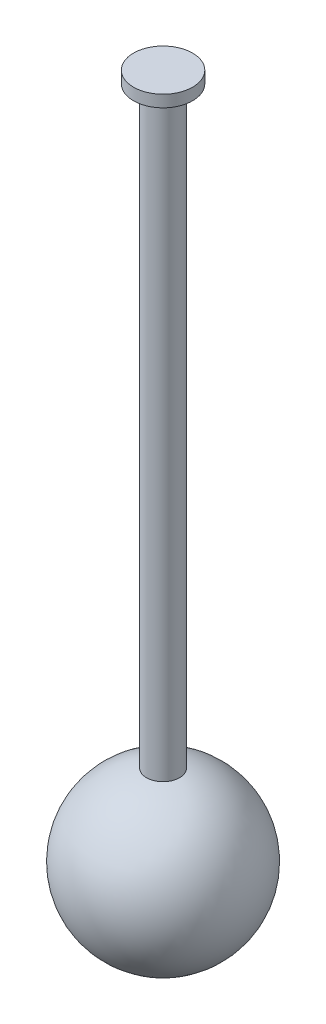
ISO-10303-21;
HEADER;
FILE_DESCRIPTION(('STEP AP214'),'2;1');
FILE_NAME('part.step','',(''),(''),'','','');
FILE_SCHEMA(('AUTOMOTIVE_DESIGN { 1 0 10303 214 1 1 1 1 }'));
ENDSEC;
DATA;
#1=APPLICATION_CONTEXT('core data for automotive mechanical design processes');
#2=APPLICATION_PROTOCOL_DEFINITION('international standard','automotive_design',2000,#1);
#3=PRODUCT_CONTEXT('',#1,'mechanical');
#4=PRODUCT('Part','Part','',(#3));
#5=PRODUCT_RELATED_PRODUCT_CATEGORY('part','',(#4));
#6=PRODUCT_DEFINITION_FORMATION('','',#4);
#7=PRODUCT_DEFINITION_CONTEXT('part definition',#1,'design');
#8=PRODUCT_DEFINITION('design','',#6,#7);
#9=PRODUCT_DEFINITION_SHAPE('','',#8);
#10=(LENGTH_UNIT() NAMED_UNIT(*) SI_UNIT(.MILLI.,.METRE.));
#11=(NAMED_UNIT(*) PLANE_ANGLE_UNIT() SI_UNIT($,.RADIAN.));
#12=(NAMED_UNIT(*) SI_UNIT($,.STERADIAN.) SOLID_ANGLE_UNIT());
#13=UNCERTAINTY_MEASURE_WITH_UNIT(LENGTH_MEASURE(1.E-05),#10,'distance_accuracy_value','');
#14=(GEOMETRIC_REPRESENTATION_CONTEXT(3) GLOBAL_UNCERTAINTY_ASSIGNED_CONTEXT((#13)) GLOBAL_UNIT_ASSIGNED_CONTEXT((#10,
#11,#12)) REPRESENTATION_CONTEXT('',''));
#15=CARTESIAN_POINT('',(0.,0.,0.));
#16=DIRECTION('',(0.,0.,1.));
#17=DIRECTION('',(1.,0.,0.));
#18=AXIS2_PLACEMENT_3D('',#15,#16,#17);
#19=CARTESIAN_POINT('',(0.,0.,0.));
#20=DIRECTION('',(0.,1.,0.));
#21=DIRECTION('',(-1.,0.,0.));
#22=AXIS2_PLACEMENT_3D('',#19,#20,#21);
#23=SPHERICAL_SURFACE('',#22,3.488);
#24=CARTESIAN_POINT('',(0.,3.41703731322911,0.));
#25=DIRECTION('',(0.,-1.,0.));
#26=DIRECTION('',(0.,0.,-1.));
#27=AXIS2_PLACEMENT_3D('',#24,#25,#26);
#28=CIRCLE('',#27,0.7);
#29=CARTESIAN_POINT('',(0.,3.41703731322911,-0.7));
#30=VERTEX_POINT('',#29);
#31=EDGE_CURVE('E10',#30,#30,#28,.F.);
#32=ORIENTED_EDGE('',*,*,#31,.F.);
#33=EDGE_LOOP('',(#32));
#34=FACE_BOUND('',#33,.T.);
#35=ADVANCED_FACE('F36',(#34),#23,.T.);
#36=CARTESIAN_POINT('',(0.,28.5,0.));
#37=DIRECTION('',(0.,-1.,0.));
#38=DIRECTION('',(0.,0.,-1.));
#39=AXIS2_PLACEMENT_3D('',#36,#37,#38);
#40=CYLINDRICAL_SURFACE('',#39,0.7);
#41=CARTESIAN_POINT('',(0.,28.5,0.));
#42=DIRECTION('',(0.,1.,0.));
#43=DIRECTION('',(0.,0.,1.));
#44=AXIS2_PLACEMENT_3D('',#41,#42,#43);
#45=CIRCLE('',#44,0.7);
#46=CARTESIAN_POINT('',(0.,28.5,-0.7));
#47=VERTEX_POINT('',#46);
#48=EDGE_CURVE('E47',#47,#47,#45,.T.);
#49=CARTESIAN_POINT('',(0.,28.5,-0.7));
#50=CARTESIAN_POINT('',(0.,28.2387191386795,-0.7));
#51=CARTESIAN_POINT('',(0.,27.9774382773589,-0.7));
#52=CARTESIAN_POINT('',(0.,27.4548765547179,-0.7));
#53=CARTESIAN_POINT('',(0.,27.1935956933974,-0.7));
#54=CARTESIAN_POINT('',(0.,26.6710339707563,-0.7));
#55=CARTESIAN_POINT('',(0.,26.4097531094358,-0.7));
#56=CARTESIAN_POINT('',(0.,25.8871913867947,-0.7));
#57=CARTESIAN_POINT('',(0.,25.6259105254742,-0.7));
#58=CARTESIAN_POINT('',(0.,25.1033488028331,-0.7));
#59=CARTESIAN_POINT('',(0.,24.8420679415126,-0.7));
#60=CARTESIAN_POINT('',(0.,24.3195062188715,-0.7));
#61=CARTESIAN_POINT('',(0.,24.058225357551,-0.7));
#62=CARTESIAN_POINT('',(0.,23.5356636349099,-0.7));
#63=CARTESIAN_POINT('',(0.,23.2743827735894,-0.7));
#64=CARTESIAN_POINT('',(0.,22.7518210509483,-0.7));
#65=CARTESIAN_POINT('',(0.,22.4905401896278,-0.7));
#66=CARTESIAN_POINT('',(0.,21.9679784669867,-0.7));
#67=CARTESIAN_POINT('',(0.,21.7066976056662,-0.7));
#68=CARTESIAN_POINT('',(0.,21.1841358830252,-0.7));
#69=CARTESIAN_POINT('',(0.,20.9228550217046,-0.7));
#70=CARTESIAN_POINT('',(0.,20.4002932990636,-0.7));
#71=CARTESIAN_POINT('',(0.,20.139012437743,-0.7));
#72=CARTESIAN_POINT('',(0.,19.616450715102,-0.7));
#73=CARTESIAN_POINT('',(0.,19.3551698537815,-0.7));
#74=CARTESIAN_POINT('',(0.,18.8326081311404,-0.7));
#75=CARTESIAN_POINT('',(0.,18.5713272698199,-0.7));
#76=CARTESIAN_POINT('',(0.,18.0487655471788,-0.7));
#77=CARTESIAN_POINT('',(0.,17.7874846858583,-0.7));
#78=CARTESIAN_POINT('',(0.,17.2649229632172,-0.7));
#79=CARTESIAN_POINT('',(0.,17.0036421018967,-0.7));
#80=CARTESIAN_POINT('',(0.,16.4810803792556,-0.7));
#81=CARTESIAN_POINT('',(0.,16.2197995179351,-0.7));
#82=CARTESIAN_POINT('',(0.,15.697237795294,-0.7));
#83=CARTESIAN_POINT('',(0.,15.4359569339735,-0.7));
#84=CARTESIAN_POINT('',(0.,14.9133952113324,-0.7));
#85=CARTESIAN_POINT('',(0.,14.6521143500119,-0.7));
#86=CARTESIAN_POINT('',(0.,14.1295526273708,-0.7));
#87=CARTESIAN_POINT('',(0.,13.8682717660503,-0.7));
#88=CARTESIAN_POINT('',(0.,13.3457100434093,-0.7));
#89=CARTESIAN_POINT('',(0.,13.0844291820887,-0.7));
#90=CARTESIAN_POINT('',(0.,12.5618674594477,-0.7));
#91=CARTESIAN_POINT('',(0.,12.3005865981271,-0.7));
#92=CARTESIAN_POINT('',(0.,11.7780248754861,-0.7));
#93=CARTESIAN_POINT('',(0.,11.5167440141655,-0.7));
#94=CARTESIAN_POINT('',(0.,10.9941822915245,-0.7));
#95=CARTESIAN_POINT('',(0.,10.732901430204,-0.7));
#96=CARTESIAN_POINT('',(0.,10.2103397075629,-0.7));
#97=CARTESIAN_POINT('',(0.,9.94905884624237,-0.7));
#98=CARTESIAN_POINT('',(0.,9.42649712360131,-0.7));
#99=CARTESIAN_POINT('',(0.,9.16521626228078,-0.7));
#100=CARTESIAN_POINT('',(0.,8.64265453963972,-0.7));
#101=CARTESIAN_POINT('',(0.,8.38137367831919,-0.7));
#102=CARTESIAN_POINT('',(0.,7.85881195567813,-0.7));
#103=CARTESIAN_POINT('',(0.,7.59753109435759,-0.7));
#104=CARTESIAN_POINT('',(0.,7.07496937171653,-0.7));
#105=CARTESIAN_POINT('',(0.,6.813688510396,-0.7));
#106=CARTESIAN_POINT('',(0.,6.29112678775495,-0.7));
#107=CARTESIAN_POINT('',(0.,6.02984592643442,-0.7));
#108=CARTESIAN_POINT('',(0.,5.50728420379336,-0.7));
#109=CARTESIAN_POINT('',(0.,5.24600334247283,-0.7));
#110=CARTESIAN_POINT('',(0.,4.72344161983176,-0.7));
#111=CARTESIAN_POINT('',(0.,4.46216075851124,-0.7));
#112=CARTESIAN_POINT('',(0.,3.93959903587017,-0.7));
#113=CARTESIAN_POINT('',(0.,3.67831817454964,-0.7));
#114=CARTESIAN_POINT('',(0.,3.41703731322911,-0.7));
#115=B_SPLINE_CURVE_WITH_KNOTS('',3,(#49,#50,#51,#52,#53,#54,#55,#56,#57,#58,#59,#60,#61,#62,
#63,#64,#65,#66,#67,#68,#69,#70,#71,#72,#73,#74,#75,#76,#77,#78,#79,#80,#81,#82,#83,#84,#85,#86,
#87,#88,#89,#90,#91,#92,#93,#94,#95,#96,#97,#98,#99,#100,#101,#102,#103,#104,#105,#106,#107,
#108,#109,#110,#111,#112,#113,#114),.UNSPECIFIED.,.F.,.F.,(4,2,2,2,2,2,2,2,2,2,2,2,2,2,2,2,2,2,
2,2,2,2,2,2,2,2,2,2,2,2,2,2,4),(0.,0.783842583961587,1.56768516792318,2.35152775188477,
3.13537033584636,3.91921291980795,4.70305550376954,5.48689808773113,6.27074067169272,
7.05458325565431,7.8384258396159,8.62226842357749,9.40611100753908,10.1899535915007,
10.9737961754623,11.7576387594239,12.5414813433854,13.325323927347,14.1091665113086,
14.8930090952702,15.6768516792318,16.4606942631934,17.244536847155,18.0283794311166,
18.8122220150782,19.5960645990398,20.3799071830013,21.1637497669629,21.9475923509245,
22.7314349348861,23.5152775188477,24.2991201028093,25.0829626867709),.UNSPECIFIED.);
#116=EDGE_CURVE('BSEAM66',#47,#30,#115,.T.);
#117=ORIENTED_EDGE('',*,*,#48,.F.);
#118=ORIENTED_EDGE('',*,*,#31,.T.);
#119=ORIENTED_EDGE('',*,*,#116,.T.);
#120=ORIENTED_EDGE('',*,*,#116,.F.);
#121=EDGE_LOOP('',(#117,#119,#118,#120));
#122=FACE_BOUND('',#121,.T.);
#123=ADVANCED_FACE('F66',(#122),#40,.T.);
#124=CARTESIAN_POINT('',(0.,29.,0.));
#125=DIRECTION('',(0.,-1.,0.));
#126=DIRECTION('',(0.,0.,-1.));
#127=AXIS2_PLACEMENT_3D('',#124,#125,#126);
#128=CYLINDRICAL_SURFACE('',#127,1.25);
#129=CARTESIAN_POINT('',(0.,29.,0.));
#130=DIRECTION('',(0.,1.,0.));
#131=DIRECTION('',(0.,0.,1.));
#132=AXIS2_PLACEMENT_3D('',#129,#130,#131);
#133=CIRCLE('',#132,1.25);
#134=CARTESIAN_POINT('',(0.,29.,1.25));
#135=VERTEX_POINT('',#134);
#136=EDGE_CURVE('E52',#135,#135,#133,.T.);
#137=ORIENTED_EDGE('',*,*,#136,.F.);
#138=EDGE_LOOP('',(#137));
#139=FACE_BOUND('',#138,.T.);
#140=CARTESIAN_POINT('',(0.,28.5,0.));
#141=DIRECTION('',(0.,1.,0.));
#142=DIRECTION('',(0.,0.,1.));
#143=AXIS2_PLACEMENT_3D('',#140,#141,#142);
#144=CIRCLE('',#143,1.25);
#145=CARTESIAN_POINT('',(0.,28.5,1.25));
#146=VERTEX_POINT('',#145);
#147=EDGE_CURVE('E55',#146,#146,#144,.T.);
#148=ORIENTED_EDGE('',*,*,#147,.T.);
#149=EDGE_LOOP('',(#148));
#150=FACE_BOUND('',#149,.T.);
#151=ADVANCED_FACE('F63',(#139,#150),#128,.T.);
#152=CARTESIAN_POINT('',(0.,29.,0.));
#153=DIRECTION('',(0.,1.,0.));
#154=DIRECTION('',(0.,0.,1.));
#155=AXIS2_PLACEMENT_3D('',#152,#153,#154);
#156=PLANE('',#155);
#157=ORIENTED_EDGE('',*,*,#136,.T.);
#158=EDGE_LOOP('',(#157));
#159=FACE_BOUND('',#158,.T.);
#160=ADVANCED_FACE('F61',(#159),#156,.T.);
#161=CARTESIAN_POINT('',(0.,28.5,0.));
#162=DIRECTION('',(0.,1.,0.));
#163=DIRECTION('',(0.,0.,1.));
#164=AXIS2_PLACEMENT_3D('',#161,#162,#163);
#165=PLANE('',#164);
#166=ORIENTED_EDGE('',*,*,#48,.T.);
#167=EDGE_LOOP('',(#166));
#168=FACE_BOUND('',#167,.T.);
#169=ORIENTED_EDGE('',*,*,#147,.F.);
#170=EDGE_LOOP('',(#169));
#171=FACE_BOUND('',#170,.T.);
#172=ADVANCED_FACE('F70',(#168,#171),#165,.F.);
#173=CLOSED_SHELL('',(#35,#123,#151,#160,#172));
#174=CARTESIAN_POINT('',(0.,0.,0.));
#175=DIRECTION('',(0.,1.,0.));
#176=DIRECTION('',(-1.,0.,0.));
#177=AXIS2_PLACEMENT_3D('',#174,#175,#176);
#178=SPHERICAL_SURFACE('',#177,3.46);
#179=CARTESIAN_POINT('',(0.,3.38845097352759,0.));
#180=DIRECTION('',(0.,-1.,0.));
#181=DIRECTION('',(0.,0.,-1.));
#182=AXIS2_PLACEMENT_3D('',#179,#180,#181);
#183=CIRCLE('',#182,0.7);
#184=CARTESIAN_POINT('',(0.,3.38845097352759,-0.7));
#185=VERTEX_POINT('',#184);
#186=EDGE_CURVE('E39',#185,#185,#183,.F.);
#187=ORIENTED_EDGE('',*,*,#186,.T.);
#188=EDGE_LOOP('',(#187));
#189=FACE_BOUND('',#188,.T.);
#190=ADVANCED_FACE('F98',(#189),#178,.F.);
#191=CARTESIAN_POINT('',(0.,0.,0.));
#192=DIRECTION('',(0.,1.,0.));
#193=DIRECTION('',(0.,0.,1.));
#194=AXIS2_PLACEMENT_3D('',#191,#192,#193);
#195=PLANE('',#194);
#196=CARTESIAN_POINT('',(0.,0.,0.));
#197=DIRECTION('',(0.,1.,0.));
#198=DIRECTION('',(0.,0.,1.));
#199=AXIS2_PLACEMENT_3D('',#196,#197,#198);
#200=CIRCLE('',#199,0.7);
#201=CARTESIAN_POINT('',(0.,0.,-0.7));
#202=VERTEX_POINT('',#201);
#203=EDGE_CURVE('E49',#202,#202,#200,.T.);
#204=ORIENTED_EDGE('',*,*,#203,.F.);
#205=EDGE_LOOP('',(#204));
#206=FACE_BOUND('',#205,.T.);
#207=ADVANCED_FACE('F92',(#206),#195,.F.);
#208=CARTESIAN_POINT('',(0.,3.38845097352759,-0.7));
#209=CARTESIAN_POINT('',(0.,3.35315460922001,-0.7));
#210=CARTESIAN_POINT('',(0.,3.31785824491243,-0.7));
#211=CARTESIAN_POINT('',(0.,3.24726551629727,-0.7));
#212=CARTESIAN_POINT('',(0.,3.21196915198969,-0.7));
#213=CARTESIAN_POINT('',(0.,3.14137642337453,-0.7));
#214=CARTESIAN_POINT('',(0.,3.10608005906695,-0.7));
#215=CARTESIAN_POINT('',(0.,3.0354873304518,-0.7));
#216=CARTESIAN_POINT('',(0.,3.00019096614422,-0.7));
#217=CARTESIAN_POINT('',(0.,2.92959823752906,-0.7));
#218=CARTESIAN_POINT('',(0.,2.89430187322148,-0.7));
#219=CARTESIAN_POINT('',(0.,2.82370914460632,-0.7));
#220=CARTESIAN_POINT('',(0.,2.78841278029874,-0.7));
#221=CARTESIAN_POINT('',(0.,2.71782005168359,-0.7));
#222=CARTESIAN_POINT('',(0.,2.68252368737601,-0.7));
#223=CARTESIAN_POINT('',(0.,2.61193095876085,-0.7));
#224=CARTESIAN_POINT('',(0.,2.57663459445327,-0.7));
#225=CARTESIAN_POINT('',(0.,2.50604186583811,-0.7));
#226=CARTESIAN_POINT('',(0.,2.47074550153053,-0.7));
#227=CARTESIAN_POINT('',(0.,2.40015277291537,-0.7));
#228=CARTESIAN_POINT('',(0.,2.36485640860779,-0.7));
#229=CARTESIAN_POINT('',(0.,2.29426367999264,-0.7));
#230=CARTESIAN_POINT('',(0.,2.25896731568506,-0.7));
#231=CARTESIAN_POINT('',(0.,2.1883745870699,-0.7));
#232=CARTESIAN_POINT('',(0.,2.15307822276232,-0.7));
#233=CARTESIAN_POINT('',(0.,2.08248549414716,-0.7));
#234=CARTESIAN_POINT('',(0.,2.04718912983958,-0.7));
#235=CARTESIAN_POINT('',(0.,1.97659640122442,-0.7));
#236=CARTESIAN_POINT('',(0.,1.94130003691685,-0.7));
#237=CARTESIAN_POINT('',(0.,1.87070730830169,-0.7));
#238=CARTESIAN_POINT('',(0.,1.83541094399411,-0.7));
#239=CARTESIAN_POINT('',(0.,1.76481821537895,-0.7));
#240=CARTESIAN_POINT('',(0.,1.72952185107137,-0.7));
#241=CARTESIAN_POINT('',(0.,1.65892912245621,-0.7));
#242=CARTESIAN_POINT('',(0.,1.62363275814864,-0.7));
#243=CARTESIAN_POINT('',(0.,1.55304002953348,-0.7));
#244=CARTESIAN_POINT('',(0.,1.5177436652259,-0.7));
#245=CARTESIAN_POINT('',(0.,1.44715093661074,-0.7));
#246=CARTESIAN_POINT('',(0.,1.41185457230316,-0.7));
#247=CARTESIAN_POINT('',(0.,1.341261843688,-0.7));
#248=CARTESIAN_POINT('',(0.,1.30596547938042,-0.7));
#249=CARTESIAN_POINT('',(0.,1.23537275076527,-0.7));
#250=CARTESIAN_POINT('',(0.,1.20007638645769,-0.7));
#251=CARTESIAN_POINT('',(0.,1.12948365784253,-0.7));
#252=CARTESIAN_POINT('',(0.,1.09418729353495,-0.7));
#253=CARTESIAN_POINT('',(0.,1.02359456491979,-0.7));
#254=CARTESIAN_POINT('',(0.,0.988298200612212,-0.7));
#255=CARTESIAN_POINT('',(0.,0.917705471997053,-0.7));
#256=CARTESIAN_POINT('',(0.,0.882409107689474,-0.7));
#257=CARTESIAN_POINT('',(0.,0.811816379074316,-0.7));
#258=CARTESIAN_POINT('',(0.,0.776520014766737,-0.7));
#259=CARTESIAN_POINT('',(0.,0.705927286151579,-0.7));
#260=CARTESIAN_POINT('',(0.,0.670630921844,-0.7));
#261=CARTESIAN_POINT('',(0.,0.600038193228842,-0.7));
#262=CARTESIAN_POINT('',(0.,0.564741828921263,-0.7));
#263=CARTESIAN_POINT('',(0.,0.494149100306105,-0.7));
#264=CARTESIAN_POINT('',(0.,0.458852735998526,-0.7));
#265=CARTESIAN_POINT('',(0.,0.388260007383368,-0.7));
#266=CARTESIAN_POINT('',(0.,0.352963643075789,-0.7));
#267=CARTESIAN_POINT('',(0.,0.282370914460632,-0.7));
#268=CARTESIAN_POINT('',(0.,0.247074550153053,-0.7));
#269=CARTESIAN_POINT('',(0.,0.176481821537895,-0.7));
#270=CARTESIAN_POINT('',(0.,0.141185457230316,-0.7));
#271=CARTESIAN_POINT('',(0.,0.0705927286151579,-0.7));
#272=CARTESIAN_POINT('',(0.,0.035296364307579,-0.7));
#273=CARTESIAN_POINT('',(0.,0.,-0.7));
#274=B_SPLINE_CURVE_WITH_KNOTS('',3,(#208,#209,#210,#211,#212,#213,#214,#215,#216,#217,#218,
#219,#220,#221,#222,#223,#224,#225,#226,#227,#228,#229,#230,#231,#232,#233,#234,#235,#236,#237,
#238,#239,#240,#241,#242,#243,#244,#245,#246,#247,#248,#249,#250,#251,#252,#253,#254,#255,#256,
#257,#258,#259,#260,#261,#262,#263,#264,#265,#266,#267,#268,#269,#270,#271,#272,#273),
.UNSPECIFIED.,.F.,.F.,(4,2,2,2,2,2,2,2,2,2,2,2,2,2,2,2,2,2,2,2,2,2,2,2,2,2,2,2,2,2,2,2,4),(0.,
0.105889092922737,0.211778185845474,0.317667278768211,0.423556371690947,0.529445464613684,
0.635334557536421,0.741223650459158,0.847112743381895,0.953001836304635,1.05889092922737,
1.16478002215011,1.27066911507285,1.37655820799558,1.48244730091832,1.58833639384106,
1.69422548676379,1.80011457968653,1.90600367260927,2.011892765532,2.11778185845474,
2.22367095137748,2.32956004430021,2.43544913722295,2.54133823014569,2.64722732306843,
2.75311641599116,2.8590055089139,2.96489460183664,3.07078369475938,3.17667278768211,
3.28256188060485,3.38845097352759),.UNSPECIFIED.);
#275=EDGE_CURVE('BSEAM86',#185,#202,#274,.T.);
#276=ORIENTED_EDGE('',*,*,#186,.F.);
#277=ORIENTED_EDGE('',*,*,#203,.T.);
#278=ORIENTED_EDGE('',*,*,#275,.T.);
#279=ORIENTED_EDGE('',*,*,#275,.F.);
#280=EDGE_LOOP('',(#276,#278,#277,#279));
#281=FACE_BOUND('',#280,.T.);
#282=ADVANCED_FACE('F86',(#281),#40,.T.);
#283=CLOSED_SHELL('',(#190,#207,#282));
#284=ORIENTED_CLOSED_SHELL('',*,#283,.T.);
#285=BREP_WITH_VOIDS('B2',#173,(#284));
#286=ADVANCED_BREP_SHAPE_REPRESENTATION('',(#18,#285),#14);
#287=SHAPE_DEFINITION_REPRESENTATION(#9,#286);
ENDSEC;
END-ISO-10303-21;
